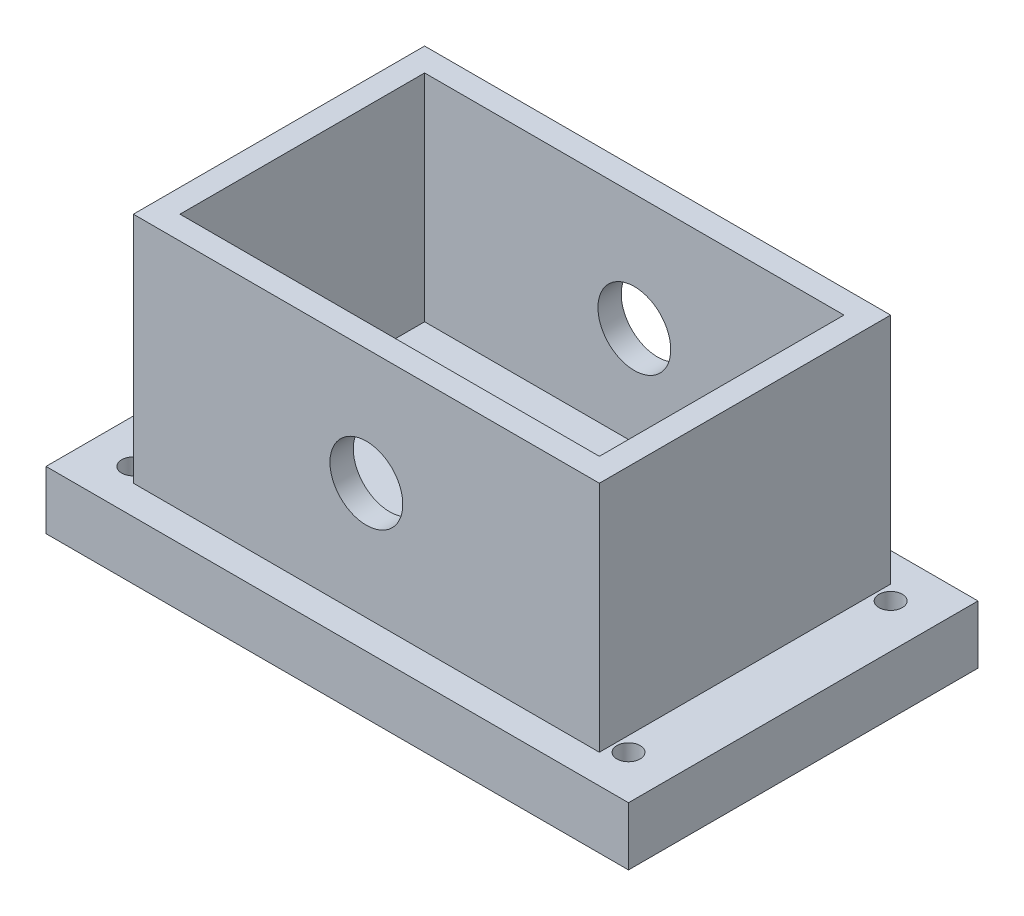
ISO-10303-21;
HEADER;
FILE_DESCRIPTION(('STEP AP214'),'2;1');
FILE_NAME('part.step','',(''),(''),'','','');
FILE_SCHEMA(('AUTOMOTIVE_DESIGN { 1 0 10303 214 1 1 1 1 }'));
ENDSEC;
DATA;
#1=APPLICATION_CONTEXT('core data for automotive mechanical design processes');
#2=APPLICATION_PROTOCOL_DEFINITION('international standard','automotive_design',2000,#1);
#3=PRODUCT_CONTEXT('',#1,'mechanical');
#4=PRODUCT('Part','Part','',(#3));
#5=PRODUCT_RELATED_PRODUCT_CATEGORY('part','',(#4));
#6=PRODUCT_DEFINITION_FORMATION('','',#4);
#7=PRODUCT_DEFINITION_CONTEXT('part definition',#1,'design');
#8=PRODUCT_DEFINITION('design','',#6,#7);
#9=PRODUCT_DEFINITION_SHAPE('','',#8);
#10=(LENGTH_UNIT() NAMED_UNIT(*) SI_UNIT(.MILLI.,.METRE.));
#11=(NAMED_UNIT(*) PLANE_ANGLE_UNIT() SI_UNIT($,.RADIAN.));
#12=(NAMED_UNIT(*) SI_UNIT($,.STERADIAN.) SOLID_ANGLE_UNIT());
#13=UNCERTAINTY_MEASURE_WITH_UNIT(LENGTH_MEASURE(1.E-05),#10,'distance_accuracy_value','');
#14=(GEOMETRIC_REPRESENTATION_CONTEXT(3) GLOBAL_UNCERTAINTY_ASSIGNED_CONTEXT((#13)) GLOBAL_UNIT_ASSIGNED_CONTEXT((#10,
#11,#12)) REPRESENTATION_CONTEXT('',''));
#15=CARTESIAN_POINT('',(0.,0.,0.));
#16=DIRECTION('',(0.,0.,1.));
#17=DIRECTION('',(1.,0.,0.));
#18=AXIS2_PLACEMENT_3D('',#15,#16,#17);
#19=CARTESIAN_POINT('',(0.,100.,0.));
#20=DIRECTION('',(0.,-1.,0.));
#21=DIRECTION('',(0.,0.,-1.));
#22=AXIS2_PLACEMENT_3D('',#19,#20,#21);
#23=PLANE('',#22);
#24=DIRECTION('',(0.,0.,1.));
#25=VECTOR('',#24,1.);
#26=CARTESIAN_POINT('',(-80.,100.,50.));
#27=LINE('',#26,#25);
#28=CARTESIAN_POINT('',(-80.,100.,-50.));
#29=VERTEX_POINT('',#28);
#30=CARTESIAN_POINT('',(-80.,100.,50.));
#31=VERTEX_POINT('',#30);
#32=EDGE_CURVE('E197',#29,#31,#27,.T.);
#33=ORIENTED_EDGE('',*,*,#32,.T.);
#34=DIRECTION('',(1.,0.,0.));
#35=VECTOR('',#34,1.);
#36=CARTESIAN_POINT('',(80.,100.,50.));
#37=LINE('',#36,#35);
#38=CARTESIAN_POINT('',(80.,100.,50.));
#39=VERTEX_POINT('',#38);
#40=EDGE_CURVE('E200',#31,#39,#37,.T.);
#41=ORIENTED_EDGE('',*,*,#40,.T.);
#42=DIRECTION('',(0.,0.,-1.));
#43=VECTOR('',#42,1.);
#44=CARTESIAN_POINT('',(80.,100.,-50.));
#45=LINE('',#44,#43);
#46=CARTESIAN_POINT('',(80.,100.,-50.));
#47=VERTEX_POINT('',#46);
#48=EDGE_CURVE('E204',#39,#47,#45,.T.);
#49=ORIENTED_EDGE('',*,*,#48,.T.);
#50=DIRECTION('',(-1.,0.,0.));
#51=VECTOR('',#50,1.);
#52=CARTESIAN_POINT('',(-80.,100.,-50.));
#53=LINE('',#52,#51);
#54=EDGE_CURVE('E207',#47,#29,#53,.T.);
#55=ORIENTED_EDGE('',*,*,#54,.T.);
#56=EDGE_LOOP('',(#33,#41,#49,#55));
#57=FACE_BOUND('',#56,.T.);
#58=DIRECTION('',(0.,0.,1.));
#59=VECTOR('',#58,1.);
#60=CARTESIAN_POINT('',(-72.,100.,42.));
#61=LINE('',#60,#59);
#62=CARTESIAN_POINT('',(-72.,100.,-42.));
#63=VERTEX_POINT('',#62);
#64=CARTESIAN_POINT('',(-72.,100.,42.));
#65=VERTEX_POINT('',#64);
#66=EDGE_CURVE('E145',#63,#65,#61,.T.);
#67=ORIENTED_EDGE('',*,*,#66,.F.);
#68=DIRECTION('',(-1.,0.,0.));
#69=VECTOR('',#68,1.);
#70=CARTESIAN_POINT('',(-72.,100.,-42.));
#71=LINE('',#70,#69);
#72=CARTESIAN_POINT('',(72.,100.,-42.));
#73=VERTEX_POINT('',#72);
#74=EDGE_CURVE('E174',#73,#63,#71,.T.);
#75=ORIENTED_EDGE('',*,*,#74,.F.);
#76=DIRECTION('',(0.,0.,-1.));
#77=VECTOR('',#76,1.);
#78=CARTESIAN_POINT('',(72.,100.,-42.));
#79=LINE('',#78,#77);
#80=CARTESIAN_POINT('',(72.,100.,42.));
#81=VERTEX_POINT('',#80);
#82=EDGE_CURVE('E169',#81,#73,#79,.T.);
#83=ORIENTED_EDGE('',*,*,#82,.F.);
#84=DIRECTION('',(1.,0.,0.));
#85=VECTOR('',#84,1.);
#86=CARTESIAN_POINT('',(72.,100.,42.));
#87=LINE('',#86,#85);
#88=EDGE_CURVE('E157',#65,#81,#87,.T.);
#89=ORIENTED_EDGE('',*,*,#88,.F.);
#90=EDGE_LOOP('',(#67,#75,#83,#89));
#91=FACE_BOUND('',#90,.T.);
#92=ADVANCED_FACE('F51',(#57,#91),#23,.F.);
#93=CARTESIAN_POINT('',(0.,20.,0.));
#94=DIRECTION('',(0.,-1.,0.));
#95=DIRECTION('',(0.,0.,-1.));
#96=AXIS2_PLACEMENT_3D('',#93,#94,#95);
#97=PLANE('',#96);
#98=CARTESIAN_POINT('',(85.,20.,-45.));
#99=DIRECTION('',(0.,-1.,0.));
#100=DIRECTION('',(0.,0.,-1.));
#101=AXIS2_PLACEMENT_3D('',#98,#99,#100);
#102=CIRCLE('',#101,4.);
#103=CARTESIAN_POINT('',(85.,20.,-49.));
#104=VERTEX_POINT('',#103);
#105=EDGE_CURVE('E183',#104,#104,#102,.F.);
#106=ORIENTED_EDGE('',*,*,#105,.F.);
#107=EDGE_LOOP('',(#106));
#108=FACE_BOUND('',#107,.T.);
#109=CARTESIAN_POINT('',(-85.,20.,45.));
#110=DIRECTION('',(0.,-1.,0.));
#111=DIRECTION('',(0.,0.,-1.));
#112=AXIS2_PLACEMENT_3D('',#109,#110,#111);
#113=CIRCLE('',#112,4.);
#114=CARTESIAN_POINT('',(-85.,20.,41.));
#115=VERTEX_POINT('',#114);
#116=EDGE_CURVE('E602',#115,#115,#113,.F.);
#117=ORIENTED_EDGE('',*,*,#116,.F.);
#118=EDGE_LOOP('',(#117));
#119=FACE_BOUND('',#118,.T.);
#120=CARTESIAN_POINT('',(-85.,20.,-45.));
#121=DIRECTION('',(0.,-1.,0.));
#122=DIRECTION('',(0.,0.,-1.));
#123=AXIS2_PLACEMENT_3D('',#120,#121,#122);
#124=CIRCLE('',#123,4.);
#125=CARTESIAN_POINT('',(-85.,20.,-49.));
#126=VERTEX_POINT('',#125);
#127=EDGE_CURVE('E598',#126,#126,#124,.F.);
#128=ORIENTED_EDGE('',*,*,#127,.F.);
#129=EDGE_LOOP('',(#128));
#130=FACE_BOUND('',#129,.T.);
#131=CARTESIAN_POINT('',(85.,20.,45.));
#132=DIRECTION('',(0.,-1.,0.));
#133=DIRECTION('',(0.,0.,-1.));
#134=AXIS2_PLACEMENT_3D('',#131,#132,#133);
#135=CIRCLE('',#134,4.);
#136=CARTESIAN_POINT('',(85.,20.,41.));
#137=VERTEX_POINT('',#136);
#138=EDGE_CURVE('E594',#137,#137,#135,.F.);
#139=ORIENTED_EDGE('',*,*,#138,.F.);
#140=EDGE_LOOP('',(#139));
#141=FACE_BOUND('',#140,.T.);
#142=DIRECTION('',(0.,0.,1.));
#143=VECTOR('',#142,1.);
#144=CARTESIAN_POINT('',(-100.,20.,60.));
#145=LINE('',#144,#143);
#146=CARTESIAN_POINT('',(-100.,20.,-60.));
#147=VERTEX_POINT('',#146);
#148=CARTESIAN_POINT('',(-100.,20.,60.));
#149=VERTEX_POINT('',#148);
#150=EDGE_CURVE('E239',#147,#149,#145,.T.);
#151=ORIENTED_EDGE('',*,*,#150,.T.);
#152=DIRECTION('',(1.,0.,0.));
#153=VECTOR('',#152,1.);
#154=CARTESIAN_POINT('',(100.,20.,60.));
#155=LINE('',#154,#153);
#156=CARTESIAN_POINT('',(100.,20.,60.));
#157=VERTEX_POINT('',#156);
#158=EDGE_CURVE('E243',#149,#157,#155,.T.);
#159=ORIENTED_EDGE('',*,*,#158,.T.);
#160=DIRECTION('',(0.,0.,-1.));
#161=VECTOR('',#160,1.);
#162=CARTESIAN_POINT('',(100.,20.,-60.));
#163=LINE('',#162,#161);
#164=CARTESIAN_POINT('',(100.,20.,-60.));
#165=VERTEX_POINT('',#164);
#166=EDGE_CURVE('E247',#157,#165,#163,.T.);
#167=ORIENTED_EDGE('',*,*,#166,.T.);
#168=DIRECTION('',(-1.,0.,0.));
#169=VECTOR('',#168,1.);
#170=CARTESIAN_POINT('',(-100.,20.,-60.));
#171=LINE('',#170,#169);
#172=EDGE_CURVE('E250',#165,#147,#171,.T.);
#173=ORIENTED_EDGE('',*,*,#172,.T.);
#174=EDGE_LOOP('',(#151,#159,#167,#173));
#175=FACE_BOUND('',#174,.T.);
#176=DIRECTION('',(0.,0.,1.));
#177=VECTOR('',#176,1.);
#178=CARTESIAN_POINT('',(-80.,20.,50.));
#179=LINE('',#178,#177);
#180=CARTESIAN_POINT('',(-80.,20.,-50.));
#181=VERTEX_POINT('',#180);
#182=CARTESIAN_POINT('',(-80.,20.,50.));
#183=VERTEX_POINT('',#182);
#184=EDGE_CURVE('E77',#181,#183,#179,.T.);
#185=ORIENTED_EDGE('',*,*,#184,.F.);
#186=DIRECTION('',(-1.,0.,0.));
#187=VECTOR('',#186,1.);
#188=CARTESIAN_POINT('',(-80.,20.,-50.));
#189=LINE('',#188,#187);
#190=CARTESIAN_POINT('',(80.,20.,-50.));
#191=VERTEX_POINT('',#190);
#192=EDGE_CURVE('E201',#191,#181,#189,.T.);
#193=ORIENTED_EDGE('',*,*,#192,.F.);
#194=DIRECTION('',(0.,0.,-1.));
#195=VECTOR('',#194,1.);
#196=CARTESIAN_POINT('',(80.,20.,-50.));
#197=LINE('',#196,#195);
#198=CARTESIAN_POINT('',(80.,20.,50.));
#199=VERTEX_POINT('',#198);
#200=EDGE_CURVE('E217',#199,#191,#197,.T.);
#201=ORIENTED_EDGE('',*,*,#200,.F.);
#202=DIRECTION('',(1.,0.,0.));
#203=VECTOR('',#202,1.);
#204=CARTESIAN_POINT('',(80.,20.,50.));
#205=LINE('',#204,#203);
#206=EDGE_CURVE('E213',#183,#199,#205,.T.);
#207=ORIENTED_EDGE('',*,*,#206,.F.);
#208=EDGE_LOOP('',(#185,#193,#201,#207));
#209=FACE_BOUND('',#208,.T.);
#210=ADVANCED_FACE('F294',(#108,#119,#130,#141,#175,#209),#97,.F.);
#211=CARTESIAN_POINT('',(-100.,20.,60.));
#212=DIRECTION('',(1.,0.,0.));
#213=DIRECTION('',(0.,0.,-1.));
#214=AXIS2_PLACEMENT_3D('',#211,#212,#213);
#215=PLANE('',#214);
#216=DIRECTION('',(0.,0.,1.));
#217=VECTOR('',#216,1.);
#218=CARTESIAN_POINT('',(-100.,0.,60.));
#219=LINE('',#218,#217);
#220=CARTESIAN_POINT('',(-100.,0.,-60.));
#221=VERTEX_POINT('',#220);
#222=CARTESIAN_POINT('',(-100.,0.,60.));
#223=VERTEX_POINT('',#222);
#224=EDGE_CURVE('E238',#221,#223,#219,.T.);
#225=ORIENTED_EDGE('',*,*,#224,.T.);
#226=DIRECTION('',(0.,-1.,0.));
#227=VECTOR('',#226,1.);
#228=CARTESIAN_POINT('',(-100.,20.,60.));
#229=LINE('',#228,#227);
#230=EDGE_CURVE('E11',#149,#223,#229,.T.);
#231=ORIENTED_EDGE('',*,*,#230,.F.);
#232=ORIENTED_EDGE('',*,*,#150,.F.);
#233=DIRECTION('',(0.,-1.,0.));
#234=VECTOR('',#233,1.);
#235=CARTESIAN_POINT('',(-100.,20.,-60.));
#236=LINE('',#235,#234);
#237=EDGE_CURVE('E253',#147,#221,#236,.T.);
#238=ORIENTED_EDGE('',*,*,#237,.T.);
#239=EDGE_LOOP('',(#225,#231,#232,#238));
#240=FACE_BOUND('',#239,.T.);
#241=ADVANCED_FACE('F54',(#240),#215,.F.);
#242=CARTESIAN_POINT('',(100.,20.,60.));
#243=DIRECTION('',(0.,0.,-1.));
#244=DIRECTION('',(-1.,0.,0.));
#245=AXIS2_PLACEMENT_3D('',#242,#243,#244);
#246=PLANE('',#245);
#247=DIRECTION('',(1.,0.,0.));
#248=VECTOR('',#247,1.);
#249=CARTESIAN_POINT('',(100.,0.,60.));
#250=LINE('',#249,#248);
#251=CARTESIAN_POINT('',(100.,0.,60.));
#252=VERTEX_POINT('',#251);
#253=EDGE_CURVE('E257',#223,#252,#250,.T.);
#254=ORIENTED_EDGE('',*,*,#253,.T.);
#255=DIRECTION('',(0.,-1.,0.));
#256=VECTOR('',#255,1.);
#257=CARTESIAN_POINT('',(100.,20.,60.));
#258=LINE('',#257,#256);
#259=EDGE_CURVE('E62',#157,#252,#258,.T.);
#260=ORIENTED_EDGE('',*,*,#259,.F.);
#261=ORIENTED_EDGE('',*,*,#158,.F.);
#262=ORIENTED_EDGE('',*,*,#230,.T.);
#263=EDGE_LOOP('',(#254,#260,#261,#262));
#264=FACE_BOUND('',#263,.T.);
#265=ADVANCED_FACE('F295',(#264),#246,.F.);
#266=CARTESIAN_POINT('',(100.,20.,-60.));
#267=DIRECTION('',(-1.,0.,0.));
#268=DIRECTION('',(0.,0.,1.));
#269=AXIS2_PLACEMENT_3D('',#266,#267,#268);
#270=PLANE('',#269);
#271=DIRECTION('',(0.,0.,-1.));
#272=VECTOR('',#271,1.);
#273=CARTESIAN_POINT('',(100.,0.,-60.));
#274=LINE('',#273,#272);
#275=CARTESIAN_POINT('',(100.,0.,-60.));
#276=VERTEX_POINT('',#275);
#277=EDGE_CURVE('E260',#252,#276,#274,.T.);
#278=ORIENTED_EDGE('',*,*,#277,.T.);
#279=DIRECTION('',(0.,-1.,0.));
#280=VECTOR('',#279,1.);
#281=CARTESIAN_POINT('',(100.,20.,-60.));
#282=LINE('',#281,#280);
#283=EDGE_CURVE('E268',#165,#276,#282,.T.);
#284=ORIENTED_EDGE('',*,*,#283,.F.);
#285=ORIENTED_EDGE('',*,*,#166,.F.);
#286=ORIENTED_EDGE('',*,*,#259,.T.);
#287=EDGE_LOOP('',(#278,#284,#285,#286));
#288=FACE_BOUND('',#287,.T.);
#289=ADVANCED_FACE('F279',(#288),#270,.F.);
#290=CARTESIAN_POINT('',(-100.,20.,-60.));
#291=DIRECTION('',(0.,0.,1.));
#292=DIRECTION('',(1.,0.,0.));
#293=AXIS2_PLACEMENT_3D('',#290,#291,#292);
#294=PLANE('',#293);
#295=DIRECTION('',(-1.,0.,0.));
#296=VECTOR('',#295,1.);
#297=CARTESIAN_POINT('',(-100.,0.,-60.));
#298=LINE('',#297,#296);
#299=EDGE_CURVE('E244',#276,#221,#298,.T.);
#300=ORIENTED_EDGE('',*,*,#299,.T.);
#301=ORIENTED_EDGE('',*,*,#237,.F.);
#302=ORIENTED_EDGE('',*,*,#172,.F.);
#303=ORIENTED_EDGE('',*,*,#283,.T.);
#304=EDGE_LOOP('',(#300,#301,#302,#303));
#305=FACE_BOUND('',#304,.T.);
#306=ADVANCED_FACE('F288',(#305),#294,.F.);
#307=CARTESIAN_POINT('',(0.,0.,0.));
#308=DIRECTION('',(0.,-1.,0.));
#309=DIRECTION('',(0.,0.,-1.));
#310=AXIS2_PLACEMENT_3D('',#307,#308,#309);
#311=PLANE('',#310);
#312=CARTESIAN_POINT('',(85.,0.,-45.));
#313=DIRECTION('',(0.,1.,0.));
#314=DIRECTION('',(0.,0.,1.));
#315=AXIS2_PLACEMENT_3D('',#312,#313,#314);
#316=CIRCLE('',#315,4.);
#317=CARTESIAN_POINT('',(85.,0.,-41.));
#318=VERTEX_POINT('',#317);
#319=EDGE_CURVE('E583',#318,#318,#316,.T.);
#320=ORIENTED_EDGE('',*,*,#319,.T.);
#321=EDGE_LOOP('',(#320));
#322=FACE_BOUND('',#321,.T.);
#323=CARTESIAN_POINT('',(-85.,0.,45.));
#324=DIRECTION('',(0.,1.,0.));
#325=DIRECTION('',(0.,0.,1.));
#326=AXIS2_PLACEMENT_3D('',#323,#324,#325);
#327=CIRCLE('',#326,4.);
#328=CARTESIAN_POINT('',(-85.,0.,49.));
#329=VERTEX_POINT('',#328);
#330=EDGE_CURVE('E576',#329,#329,#327,.T.);
#331=ORIENTED_EDGE('',*,*,#330,.T.);
#332=EDGE_LOOP('',(#331));
#333=FACE_BOUND('',#332,.T.);
#334=CARTESIAN_POINT('',(-85.,0.,-45.));
#335=DIRECTION('',(0.,1.,0.));
#336=DIRECTION('',(0.,0.,1.));
#337=AXIS2_PLACEMENT_3D('',#334,#335,#336);
#338=CIRCLE('',#337,4.);
#339=CARTESIAN_POINT('',(-85.,0.,-41.));
#340=VERTEX_POINT('',#339);
#341=EDGE_CURVE('E571',#340,#340,#338,.T.);
#342=ORIENTED_EDGE('',*,*,#341,.T.);
#343=EDGE_LOOP('',(#342));
#344=FACE_BOUND('',#343,.T.);
#345=CARTESIAN_POINT('',(85.,0.,45.));
#346=DIRECTION('',(0.,1.,0.));
#347=DIRECTION('',(0.,0.,1.));
#348=AXIS2_PLACEMENT_3D('',#345,#346,#347);
#349=CIRCLE('',#348,4.);
#350=CARTESIAN_POINT('',(85.,0.,49.));
#351=VERTEX_POINT('',#350);
#352=EDGE_CURVE('E587',#351,#351,#349,.T.);
#353=ORIENTED_EDGE('',*,*,#352,.T.);
#354=EDGE_LOOP('',(#353));
#355=FACE_BOUND('',#354,.T.);
#356=ORIENTED_EDGE('',*,*,#224,.F.);
#357=ORIENTED_EDGE('',*,*,#299,.F.);
#358=ORIENTED_EDGE('',*,*,#277,.F.);
#359=ORIENTED_EDGE('',*,*,#253,.F.);
#360=EDGE_LOOP('',(#356,#357,#358,#359));
#361=FACE_BOUND('',#360,.T.);
#362=ADVANCED_FACE('F285',(#322,#333,#344,#355,#361),#311,.T.);
#363=CARTESIAN_POINT('',(-80.,100.,50.));
#364=DIRECTION('',(1.,0.,0.));
#365=DIRECTION('',(0.,0.,-1.));
#366=AXIS2_PLACEMENT_3D('',#363,#364,#365);
#367=PLANE('',#366);
#368=ORIENTED_EDGE('',*,*,#184,.T.);
#369=DIRECTION('',(0.,-1.,0.));
#370=VECTOR('',#369,1.);
#371=CARTESIAN_POINT('',(-80.,100.,50.));
#372=LINE('',#371,#370);
#373=EDGE_CURVE('E234',#31,#183,#372,.T.);
#374=ORIENTED_EDGE('',*,*,#373,.F.);
#375=ORIENTED_EDGE('',*,*,#32,.F.);
#376=DIRECTION('',(0.,-1.,0.));
#377=VECTOR('',#376,1.);
#378=CARTESIAN_POINT('',(-80.,100.,-50.));
#379=LINE('',#378,#377);
#380=EDGE_CURVE('E210',#29,#181,#379,.T.);
#381=ORIENTED_EDGE('',*,*,#380,.T.);
#382=EDGE_LOOP('',(#368,#374,#375,#381));
#383=FACE_BOUND('',#382,.T.);
#384=ADVANCED_FACE('F330',(#383),#367,.F.);
#385=CARTESIAN_POINT('',(80.,100.,50.));
#386=DIRECTION('',(0.,0.,-1.));
#387=DIRECTION('',(-1.,0.,0.));
#388=AXIS2_PLACEMENT_3D('',#385,#386,#387);
#389=PLANE('',#388);
#390=CARTESIAN_POINT('',(0.,60.,50.));
#391=DIRECTION('',(0.,0.,-1.));
#392=DIRECTION('',(-1.,0.,0.));
#393=AXIS2_PLACEMENT_3D('',#390,#391,#392);
#394=CIRCLE('',#393,12.5);
#395=CARTESIAN_POINT('',(-12.5,60.,50.));
#396=VERTEX_POINT('',#395);
#397=EDGE_CURVE('E569',#396,#396,#394,.T.);
#398=ORIENTED_EDGE('',*,*,#397,.T.);
#399=EDGE_LOOP('',(#398));
#400=FACE_BOUND('',#399,.T.);
#401=ORIENTED_EDGE('',*,*,#206,.T.);
#402=DIRECTION('',(0.,-1.,0.));
#403=VECTOR('',#402,1.);
#404=CARTESIAN_POINT('',(80.,100.,50.));
#405=LINE('',#404,#403);
#406=EDGE_CURVE('E230',#39,#199,#405,.T.);
#407=ORIENTED_EDGE('',*,*,#406,.F.);
#408=ORIENTED_EDGE('',*,*,#40,.F.);
#409=ORIENTED_EDGE('',*,*,#373,.T.);
#410=EDGE_LOOP('',(#401,#407,#408,#409));
#411=FACE_BOUND('',#410,.T.);
#412=ADVANCED_FACE('F326',(#400,#411),#389,.F.);
#413=CARTESIAN_POINT('',(80.,100.,-50.));
#414=DIRECTION('',(-1.,0.,0.));
#415=DIRECTION('',(0.,0.,1.));
#416=AXIS2_PLACEMENT_3D('',#413,#414,#415);
#417=PLANE('',#416);
#418=ORIENTED_EDGE('',*,*,#200,.T.);
#419=DIRECTION('',(0.,-1.,0.));
#420=VECTOR('',#419,1.);
#421=CARTESIAN_POINT('',(80.,100.,-50.));
#422=LINE('',#421,#420);
#423=EDGE_CURVE('E226',#47,#191,#422,.T.);
#424=ORIENTED_EDGE('',*,*,#423,.F.);
#425=ORIENTED_EDGE('',*,*,#48,.F.);
#426=ORIENTED_EDGE('',*,*,#406,.T.);
#427=EDGE_LOOP('',(#418,#424,#425,#426));
#428=FACE_BOUND('',#427,.T.);
#429=ADVANCED_FACE('F321',(#428),#417,.F.);
#430=CARTESIAN_POINT('',(-80.,100.,-50.));
#431=DIRECTION('',(0.,0.,1.));
#432=DIRECTION('',(1.,0.,0.));
#433=AXIS2_PLACEMENT_3D('',#430,#431,#432);
#434=PLANE('',#433);
#435=CARTESIAN_POINT('',(0.,60.,-50.));
#436=DIRECTION('',(0.,0.,1.));
#437=DIRECTION('',(1.,0.,0.));
#438=AXIS2_PLACEMENT_3D('',#435,#436,#437);
#439=CIRCLE('',#438,12.5);
#440=CARTESIAN_POINT('',(12.5,60.,-50.));
#441=VERTEX_POINT('',#440);
#442=EDGE_CURVE('E572',#441,#441,#439,.T.);
#443=ORIENTED_EDGE('',*,*,#442,.T.);
#444=EDGE_LOOP('',(#443));
#445=FACE_BOUND('',#444,.T.);
#446=ORIENTED_EDGE('',*,*,#192,.T.);
#447=ORIENTED_EDGE('',*,*,#380,.F.);
#448=ORIENTED_EDGE('',*,*,#54,.F.);
#449=ORIENTED_EDGE('',*,*,#423,.T.);
#450=EDGE_LOOP('',(#446,#447,#448,#449));
#451=FACE_BOUND('',#450,.T.);
#452=ADVANCED_FACE('F317',(#445,#451),#434,.F.);
#453=CARTESIAN_POINT('',(-72.,100.,42.));
#454=DIRECTION('',(1.,0.,0.));
#455=DIRECTION('',(0.,0.,-1.));
#456=AXIS2_PLACEMENT_3D('',#453,#454,#455);
#457=PLANE('',#456);
#458=DIRECTION('',(0.,0.,1.));
#459=VECTOR('',#458,1.);
#460=CARTESIAN_POINT('',(-72.,26.,42.));
#461=LINE('',#460,#459);
#462=CARTESIAN_POINT('',(-72.,26.,-42.));
#463=VERTEX_POINT('',#462);
#464=CARTESIAN_POINT('',(-72.,26.,42.));
#465=VERTEX_POINT('',#464);
#466=EDGE_CURVE('E180',#463,#465,#461,.T.);
#467=ORIENTED_EDGE('',*,*,#466,.F.);
#468=DIRECTION('',(0.,-1.,0.));
#469=VECTOR('',#468,1.);
#470=CARTESIAN_POINT('',(-72.,100.,-42.));
#471=LINE('',#470,#469);
#472=EDGE_CURVE('E152',#63,#463,#471,.T.);
#473=ORIENTED_EDGE('',*,*,#472,.F.);
#474=ORIENTED_EDGE('',*,*,#66,.T.);
#475=DIRECTION('',(0.,-1.,0.));
#476=VECTOR('',#475,1.);
#477=CARTESIAN_POINT('',(-72.,100.,42.));
#478=LINE('',#477,#476);
#479=EDGE_CURVE('E149',#65,#465,#478,.T.);
#480=ORIENTED_EDGE('',*,*,#479,.T.);
#481=EDGE_LOOP('',(#467,#473,#474,#480));
#482=FACE_BOUND('',#481,.T.);
#483=ADVANCED_FACE('F148',(#482),#457,.T.);
#484=CARTESIAN_POINT('',(72.,100.,42.));
#485=DIRECTION('',(0.,0.,-1.));
#486=DIRECTION('',(-1.,0.,0.));
#487=AXIS2_PLACEMENT_3D('',#484,#485,#486);
#488=PLANE('',#487);
#489=CARTESIAN_POINT('',(0.,60.,42.));
#490=DIRECTION('',(0.,0.,-1.));
#491=DIRECTION('',(-1.,0.,0.));
#492=AXIS2_PLACEMENT_3D('',#489,#490,#491);
#493=CIRCLE('',#492,12.5);
#494=CARTESIAN_POINT('',(-12.5,60.,42.));
#495=VERTEX_POINT('',#494);
#496=EDGE_CURVE('E566',#495,#495,#493,.T.);
#497=ORIENTED_EDGE('',*,*,#496,.F.);
#498=EDGE_LOOP('',(#497));
#499=FACE_BOUND('',#498,.T.);
#500=DIRECTION('',(1.,0.,0.));
#501=VECTOR('',#500,1.);
#502=CARTESIAN_POINT('',(72.,26.,42.));
#503=LINE('',#502,#501);
#504=CARTESIAN_POINT('',(72.,26.,42.));
#505=VERTEX_POINT('',#504);
#506=EDGE_CURVE('E164',#465,#505,#503,.T.);
#507=ORIENTED_EDGE('',*,*,#506,.F.);
#508=ORIENTED_EDGE('',*,*,#479,.F.);
#509=ORIENTED_EDGE('',*,*,#88,.T.);
#510=DIRECTION('',(0.,-1.,0.));
#511=VECTOR('',#510,1.);
#512=CARTESIAN_POINT('',(72.,100.,42.));
#513=LINE('',#512,#511);
#514=EDGE_CURVE('E166',#81,#505,#513,.T.);
#515=ORIENTED_EDGE('',*,*,#514,.T.);
#516=EDGE_LOOP('',(#507,#508,#509,#515));
#517=FACE_BOUND('',#516,.T.);
#518=ADVANCED_FACE('F161',(#499,#517),#488,.T.);
#519=CARTESIAN_POINT('',(72.,100.,-42.));
#520=DIRECTION('',(-1.,0.,0.));
#521=DIRECTION('',(0.,0.,1.));
#522=AXIS2_PLACEMENT_3D('',#519,#520,#521);
#523=PLANE('',#522);
#524=DIRECTION('',(0.,0.,-1.));
#525=VECTOR('',#524,1.);
#526=CARTESIAN_POINT('',(72.,26.,-42.));
#527=LINE('',#526,#525);
#528=CARTESIAN_POINT('',(72.,26.,-42.));
#529=VERTEX_POINT('',#528);
#530=EDGE_CURVE('E186',#505,#529,#527,.T.);
#531=ORIENTED_EDGE('',*,*,#530,.F.);
#532=ORIENTED_EDGE('',*,*,#514,.F.);
#533=ORIENTED_EDGE('',*,*,#82,.T.);
#534=DIRECTION('',(0.,-1.,0.));
#535=VECTOR('',#534,1.);
#536=CARTESIAN_POINT('',(72.,100.,-42.));
#537=LINE('',#536,#535);
#538=EDGE_CURVE('E69',#73,#529,#537,.T.);
#539=ORIENTED_EDGE('',*,*,#538,.T.);
#540=EDGE_LOOP('',(#531,#532,#533,#539));
#541=FACE_BOUND('',#540,.T.);
#542=ADVANCED_FACE('F362',(#541),#523,.T.);
#543=CARTESIAN_POINT('',(-72.,100.,-42.));
#544=DIRECTION('',(0.,0.,1.));
#545=DIRECTION('',(1.,0.,0.));
#546=AXIS2_PLACEMENT_3D('',#543,#544,#545);
#547=PLANE('',#546);
#548=CARTESIAN_POINT('',(0.,60.,-42.));
#549=DIRECTION('',(0.,0.,1.));
#550=DIRECTION('',(1.,0.,0.));
#551=AXIS2_PLACEMENT_3D('',#548,#549,#550);
#552=CIRCLE('',#551,12.5);
#553=CARTESIAN_POINT('',(12.5,60.,-42.));
#554=VERTEX_POINT('',#553);
#555=EDGE_CURVE('E56',#554,#554,#552,.T.);
#556=ORIENTED_EDGE('',*,*,#555,.F.);
#557=EDGE_LOOP('',(#556));
#558=FACE_BOUND('',#557,.T.);
#559=DIRECTION('',(-1.,0.,0.));
#560=VECTOR('',#559,1.);
#561=CARTESIAN_POINT('',(-72.,26.,-42.));
#562=LINE('',#561,#560);
#563=EDGE_CURVE('E158',#529,#463,#562,.T.);
#564=ORIENTED_EDGE('',*,*,#563,.F.);
#565=ORIENTED_EDGE('',*,*,#538,.F.);
#566=ORIENTED_EDGE('',*,*,#74,.T.);
#567=ORIENTED_EDGE('',*,*,#472,.T.);
#568=EDGE_LOOP('',(#564,#565,#566,#567));
#569=FACE_BOUND('',#568,.T.);
#570=ADVANCED_FACE('F367',(#558,#569),#547,.T.);
#571=CARTESIAN_POINT('',(0.,26.,0.));
#572=DIRECTION('',(0.,-1.,0.));
#573=DIRECTION('',(0.,0.,-1.));
#574=AXIS2_PLACEMENT_3D('',#571,#572,#573);
#575=PLANE('',#574);
#576=ORIENTED_EDGE('',*,*,#466,.T.);
#577=ORIENTED_EDGE('',*,*,#506,.T.);
#578=ORIENTED_EDGE('',*,*,#530,.T.);
#579=ORIENTED_EDGE('',*,*,#563,.T.);
#580=EDGE_LOOP('',(#576,#577,#578,#579));
#581=FACE_BOUND('',#580,.T.);
#582=ADVANCED_FACE('F373',(#581),#575,.F.);
#583=CARTESIAN_POINT('',(85.,100.,45.));
#584=DIRECTION('',(0.,-1.,0.));
#585=DIRECTION('',(0.,0.,-1.));
#586=AXIS2_PLACEMENT_3D('',#583,#584,#585);
#587=CYLINDRICAL_SURFACE('',#586,4.);
#588=ORIENTED_EDGE('',*,*,#352,.F.);
#589=EDGE_LOOP('',(#588));
#590=FACE_BOUND('',#589,.T.);
#591=ORIENTED_EDGE('',*,*,#138,.T.);
#592=EDGE_LOOP('',(#591));
#593=FACE_BOUND('',#592,.T.);
#594=ADVANCED_FACE('F379',(#590,#593),#587,.F.);
#595=CARTESIAN_POINT('',(-85.,100.,-45.));
#596=DIRECTION('',(0.,-1.,0.));
#597=DIRECTION('',(0.,0.,-1.));
#598=AXIS2_PLACEMENT_3D('',#595,#596,#597);
#599=CYLINDRICAL_SURFACE('',#598,4.);
#600=ORIENTED_EDGE('',*,*,#341,.F.);
#601=EDGE_LOOP('',(#600));
#602=FACE_BOUND('',#601,.T.);
#603=ORIENTED_EDGE('',*,*,#127,.T.);
#604=EDGE_LOOP('',(#603));
#605=FACE_BOUND('',#604,.T.);
#606=ADVANCED_FACE('F385',(#602,#605),#599,.F.);
#607=CARTESIAN_POINT('',(-85.,100.,45.));
#608=DIRECTION('',(0.,-1.,0.));
#609=DIRECTION('',(0.,0.,-1.));
#610=AXIS2_PLACEMENT_3D('',#607,#608,#609);
#611=CYLINDRICAL_SURFACE('',#610,4.);
#612=ORIENTED_EDGE('',*,*,#330,.F.);
#613=EDGE_LOOP('',(#612));
#614=FACE_BOUND('',#613,.T.);
#615=ORIENTED_EDGE('',*,*,#116,.T.);
#616=EDGE_LOOP('',(#615));
#617=FACE_BOUND('',#616,.T.);
#618=ADVANCED_FACE('F391',(#614,#617),#611,.F.);
#619=CARTESIAN_POINT('',(85.,100.,-45.));
#620=DIRECTION('',(0.,-1.,0.));
#621=DIRECTION('',(0.,0.,-1.));
#622=AXIS2_PLACEMENT_3D('',#619,#620,#621);
#623=CYLINDRICAL_SURFACE('',#622,4.);
#624=ORIENTED_EDGE('',*,*,#319,.F.);
#625=EDGE_LOOP('',(#624));
#626=FACE_BOUND('',#625,.T.);
#627=ORIENTED_EDGE('',*,*,#105,.T.);
#628=EDGE_LOOP('',(#627));
#629=FACE_BOUND('',#628,.T.);
#630=ADVANCED_FACE('F397',(#626,#629),#623,.F.);
#631=CARTESIAN_POINT('',(0.,60.,-201.));
#632=DIRECTION('',(0.,0.,1.));
#633=DIRECTION('',(1.,0.,0.));
#634=AXIS2_PLACEMENT_3D('',#631,#632,#633);
#635=CYLINDRICAL_SURFACE('',#634,12.5);
#636=ORIENTED_EDGE('',*,*,#555,.T.);
#637=EDGE_LOOP('',(#636));
#638=FACE_BOUND('',#637,.T.);
#639=ORIENTED_EDGE('',*,*,#442,.F.);
#640=EDGE_LOOP('',(#639));
#641=FACE_BOUND('',#640,.T.);
#642=ADVANCED_FACE('F403',(#638,#641),#635,.F.);
#643=ORIENTED_EDGE('',*,*,#496,.T.);
#644=EDGE_LOOP('',(#643));
#645=FACE_BOUND('',#644,.T.);
#646=ORIENTED_EDGE('',*,*,#397,.F.);
#647=EDGE_LOOP('',(#646));
#648=FACE_BOUND('',#647,.T.);
#649=ADVANCED_FACE('F409',(#645,#648),#635,.F.);
#650=CLOSED_SHELL('',(#92,#210,#241,#265,#289,#306,#362,#384,#412,#429,#452,#483,#518,#542,#570,
#582,#594,#606,#618,#630,#642,#649));
#651=MANIFOLD_SOLID_BREP('B2',#650);
#652=ADVANCED_BREP_SHAPE_REPRESENTATION('',(#18,#651),#14);
#653=SHAPE_DEFINITION_REPRESENTATION(#9,#652);
ENDSEC;
END-ISO-10303-21;
